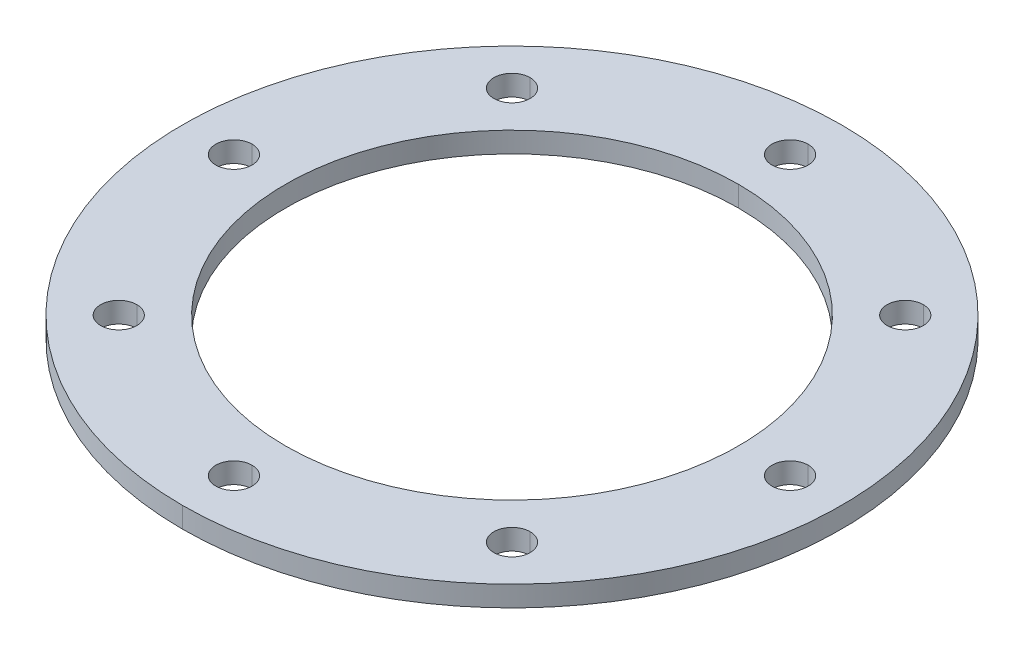
ISO-10303-21;
HEADER;
FILE_DESCRIPTION(('STEP AP214'),'2;1');
FILE_NAME('part.step','',(''),(''),'','','');
FILE_SCHEMA(('AUTOMOTIVE_DESIGN { 1 0 10303 214 1 1 1 1 }'));
ENDSEC;
DATA;
#1=APPLICATION_CONTEXT('core data for automotive mechanical design processes');
#2=APPLICATION_PROTOCOL_DEFINITION('international standard','automotive_design',2000,#1);
#3=PRODUCT_CONTEXT('',#1,'mechanical');
#4=PRODUCT('Part','Part','',(#3));
#5=PRODUCT_RELATED_PRODUCT_CATEGORY('part','',(#4));
#6=PRODUCT_DEFINITION_FORMATION('','',#4);
#7=PRODUCT_DEFINITION_CONTEXT('part definition',#1,'design');
#8=PRODUCT_DEFINITION('design','',#6,#7);
#9=PRODUCT_DEFINITION_SHAPE('','',#8);
#10=(LENGTH_UNIT() NAMED_UNIT(*) SI_UNIT(.MILLI.,.METRE.));
#11=(NAMED_UNIT(*) PLANE_ANGLE_UNIT() SI_UNIT($,.RADIAN.));
#12=(NAMED_UNIT(*) SI_UNIT($,.STERADIAN.) SOLID_ANGLE_UNIT());
#13=UNCERTAINTY_MEASURE_WITH_UNIT(LENGTH_MEASURE(1.E-05),#10,'distance_accuracy_value','');
#14=(GEOMETRIC_REPRESENTATION_CONTEXT(3) GLOBAL_UNCERTAINTY_ASSIGNED_CONTEXT((#13)) GLOBAL_UNIT_ASSIGNED_CONTEXT((#10,
#11,#12)) REPRESENTATION_CONTEXT('',''));
#15=CARTESIAN_POINT('',(0.,0.,0.));
#16=DIRECTION('',(0.,0.,1.));
#17=DIRECTION('',(1.,0.,0.));
#18=AXIS2_PLACEMENT_3D('',#15,#16,#17);
#19=CARTESIAN_POINT('',(47.729707730092,5.,-47.729707730092));
#20=DIRECTION('',(0.,-1.,0.));
#21=DIRECTION('',(0.,0.,-1.));
#22=AXIS2_PLACEMENT_3D('',#19,#20,#21);
#23=CYLINDRICAL_SURFACE('',#22,4.4);
#24=DIRECTION('',(0.,-1.,0.));
#25=VECTOR('',#24,1.);
#26=CARTESIAN_POINT('',(47.729707730092,5.,-43.3297077300919));
#27=LINE('',#26,#25);
#28=CARTESIAN_POINT('',(47.729707730092,5.,-43.3297077300919));
#29=VERTEX_POINT('',#28);
#30=CARTESIAN_POINT('',(47.729707730092,0.,-43.3297077300919));
#31=VERTEX_POINT('',#30);
#32=EDGE_CURVE('E202',#29,#31,#27,.T.);
#33=ORIENTED_EDGE('',*,*,#32,.F.);
#34=CARTESIAN_POINT('',(47.729707730092,5.,-47.729707730092));
#35=DIRECTION('',(0.,1.,0.));
#36=DIRECTION('',(0.,0.,1.));
#37=AXIS2_PLACEMENT_3D('',#34,#35,#36);
#38=CIRCLE('',#37,4.4);
#39=CARTESIAN_POINT('',(47.729707730092,5.,-52.129707730092));
#40=VERTEX_POINT('',#39);
#41=EDGE_CURVE('E199',#29,#40,#38,.T.);
#42=ORIENTED_EDGE('',*,*,#41,.T.);
#43=DIRECTION('',(0.,-1.,0.));
#44=VECTOR('',#43,1.);
#45=CARTESIAN_POINT('',(47.729707730092,5.,-52.129707730092));
#46=LINE('',#45,#44);
#47=CARTESIAN_POINT('',(47.729707730092,0.,-52.129707730092));
#48=VERTEX_POINT('',#47);
#49=EDGE_CURVE('E205',#40,#48,#46,.T.);
#50=ORIENTED_EDGE('',*,*,#49,.T.);
#51=CARTESIAN_POINT('',(47.729707730092,0.,-47.729707730092));
#52=DIRECTION('',(0.,1.,0.));
#53=DIRECTION('',(0.,0.,1.));
#54=AXIS2_PLACEMENT_3D('',#51,#52,#53);
#55=CIRCLE('',#54,4.4);
#56=EDGE_CURVE('E11',#31,#48,#55,.T.);
#57=ORIENTED_EDGE('',*,*,#56,.F.);
#58=EDGE_LOOP('',(#33,#42,#50,#57));
#59=FACE_BOUND('',#58,.T.);
#60=ADVANCED_FACE('F17',(#59),#23,.F.);
#61=CARTESIAN_POINT('',(0.,5.,-67.5));
#62=DIRECTION('',(0.,-1.,0.));
#63=DIRECTION('',(0.,0.,-1.));
#64=AXIS2_PLACEMENT_3D('',#61,#62,#63);
#65=CYLINDRICAL_SURFACE('',#64,4.4);
#66=DIRECTION('',(0.,-1.,0.));
#67=VECTOR('',#66,1.);
#68=CARTESIAN_POINT('',(0.,5.,-63.1));
#69=LINE('',#68,#67);
#70=CARTESIAN_POINT('',(0.,5.,-63.1));
#71=VERTEX_POINT('',#70);
#72=CARTESIAN_POINT('',(0.,0.,-63.1));
#73=VERTEX_POINT('',#72);
#74=EDGE_CURVE('E251',#71,#73,#69,.T.);
#75=ORIENTED_EDGE('',*,*,#74,.F.);
#76=CARTESIAN_POINT('',(0.,5.,-67.5));
#77=DIRECTION('',(0.,1.,0.));
#78=DIRECTION('',(0.,0.,1.));
#79=AXIS2_PLACEMENT_3D('',#76,#77,#78);
#80=CIRCLE('',#79,4.4);
#81=CARTESIAN_POINT('',(0.,5.,-71.9));
#82=VERTEX_POINT('',#81);
#83=EDGE_CURVE('E378',#71,#82,#80,.T.);
#84=ORIENTED_EDGE('',*,*,#83,.T.);
#85=DIRECTION('',(0.,-1.,0.));
#86=VECTOR('',#85,1.);
#87=CARTESIAN_POINT('',(0.,5.,-71.9));
#88=LINE('',#87,#86);
#89=CARTESIAN_POINT('',(0.,0.,-71.9));
#90=VERTEX_POINT('',#89);
#91=EDGE_CURVE('E270',#82,#90,#88,.T.);
#92=ORIENTED_EDGE('',*,*,#91,.T.);
#93=CARTESIAN_POINT('',(0.,0.,-67.5));
#94=DIRECTION('',(0.,1.,0.));
#95=DIRECTION('',(0.,0.,1.));
#96=AXIS2_PLACEMENT_3D('',#93,#94,#95);
#97=CIRCLE('',#96,4.4);
#98=EDGE_CURVE('E25',#73,#90,#97,.T.);
#99=ORIENTED_EDGE('',*,*,#98,.F.);
#100=EDGE_LOOP('',(#75,#84,#92,#99));
#101=FACE_BOUND('',#100,.T.);
#102=ADVANCED_FACE('F427',(#101),#65,.F.);
#103=CARTESIAN_POINT('',(-47.729707730092,5.,-47.729707730092));
#104=DIRECTION('',(0.,-1.,0.));
#105=DIRECTION('',(0.,0.,-1.));
#106=AXIS2_PLACEMENT_3D('',#103,#104,#105);
#107=CYLINDRICAL_SURFACE('',#106,4.4);
#108=DIRECTION('',(0.,-1.,0.));
#109=VECTOR('',#108,1.);
#110=CARTESIAN_POINT('',(-47.729707730092,5.,-43.3297077300919));
#111=LINE('',#110,#109);
#112=CARTESIAN_POINT('',(-47.729707730092,5.,-43.3297077300919));
#113=VERTEX_POINT('',#112);
#114=CARTESIAN_POINT('',(-47.729707730092,0.,-43.3297077300919));
#115=VERTEX_POINT('',#114);
#116=EDGE_CURVE('E238',#113,#115,#111,.T.);
#117=ORIENTED_EDGE('',*,*,#116,.F.);
#118=CARTESIAN_POINT('',(-47.729707730092,5.,-47.729707730092));
#119=DIRECTION('',(0.,1.,0.));
#120=DIRECTION('',(0.,0.,1.));
#121=AXIS2_PLACEMENT_3D('',#118,#119,#120);
#122=CIRCLE('',#121,4.4);
#123=CARTESIAN_POINT('',(-47.729707730092,5.,-52.129707730092));
#124=VERTEX_POINT('',#123);
#125=EDGE_CURVE('E209',#113,#124,#122,.T.);
#126=ORIENTED_EDGE('',*,*,#125,.T.);
#127=DIRECTION('',(0.,-1.,0.));
#128=VECTOR('',#127,1.);
#129=CARTESIAN_POINT('',(-47.729707730092,5.,-52.129707730092));
#130=LINE('',#129,#128);
#131=CARTESIAN_POINT('',(-47.729707730092,0.,-52.129707730092));
#132=VERTEX_POINT('',#131);
#133=EDGE_CURVE('E284',#124,#132,#130,.T.);
#134=ORIENTED_EDGE('',*,*,#133,.T.);
#135=CARTESIAN_POINT('',(-47.729707730092,0.,-47.729707730092));
#136=DIRECTION('',(0.,1.,0.));
#137=DIRECTION('',(0.,0.,1.));
#138=AXIS2_PLACEMENT_3D('',#135,#136,#137);
#139=CIRCLE('',#138,4.4);
#140=EDGE_CURVE('E400',#115,#132,#139,.T.);
#141=ORIENTED_EDGE('',*,*,#140,.F.);
#142=EDGE_LOOP('',(#117,#126,#134,#141));
#143=FACE_BOUND('',#142,.T.);
#144=ADVANCED_FACE('F456',(#143),#107,.F.);
#145=CARTESIAN_POINT('',(-67.5,5.,0.));
#146=DIRECTION('',(0.,-1.,0.));
#147=DIRECTION('',(0.,0.,-1.));
#148=AXIS2_PLACEMENT_3D('',#145,#146,#147);
#149=CYLINDRICAL_SURFACE('',#148,4.4);
#150=DIRECTION('',(0.,-1.,0.));
#151=VECTOR('',#150,1.);
#152=CARTESIAN_POINT('',(-67.5,5.,4.4));
#153=LINE('',#152,#151);
#154=CARTESIAN_POINT('',(-67.5,5.,4.4));
#155=VERTEX_POINT('',#154);
#156=CARTESIAN_POINT('',(-67.5,0.,4.4));
#157=VERTEX_POINT('',#156);
#158=EDGE_CURVE('E255',#155,#157,#153,.T.);
#159=ORIENTED_EDGE('',*,*,#158,.F.);
#160=CARTESIAN_POINT('',(-67.5,5.,0.));
#161=DIRECTION('',(0.,1.,0.));
#162=DIRECTION('',(0.,0.,1.));
#163=AXIS2_PLACEMENT_3D('',#160,#161,#162);
#164=CIRCLE('',#163,4.4);
#165=CARTESIAN_POINT('',(-67.5,5.,-4.4));
#166=VERTEX_POINT('',#165);
#167=EDGE_CURVE('E381',#155,#166,#164,.T.);
#168=ORIENTED_EDGE('',*,*,#167,.T.);
#169=DIRECTION('',(0.,-1.,0.));
#170=VECTOR('',#169,1.);
#171=CARTESIAN_POINT('',(-67.5,5.,-4.4));
#172=LINE('',#171,#170);
#173=CARTESIAN_POINT('',(-67.5,0.,-4.4));
#174=VERTEX_POINT('',#173);
#175=EDGE_CURVE('E288',#166,#174,#172,.T.);
#176=ORIENTED_EDGE('',*,*,#175,.T.);
#177=CARTESIAN_POINT('',(-67.5,0.,0.));
#178=DIRECTION('',(0.,1.,0.));
#179=DIRECTION('',(0.,0.,1.));
#180=AXIS2_PLACEMENT_3D('',#177,#178,#179);
#181=CIRCLE('',#180,4.4);
#182=EDGE_CURVE('E398',#157,#174,#181,.T.);
#183=ORIENTED_EDGE('',*,*,#182,.F.);
#184=EDGE_LOOP('',(#159,#168,#176,#183));
#185=FACE_BOUND('',#184,.T.);
#186=ADVANCED_FACE('F465',(#185),#149,.F.);
#187=CARTESIAN_POINT('',(-47.729707730092,5.,47.729707730092));
#188=DIRECTION('',(0.,-1.,0.));
#189=DIRECTION('',(0.,0.,-1.));
#190=AXIS2_PLACEMENT_3D('',#187,#188,#189);
#191=CYLINDRICAL_SURFACE('',#190,4.4);
#192=DIRECTION('',(0.,-1.,0.));
#193=VECTOR('',#192,1.);
#194=CARTESIAN_POINT('',(-47.729707730092,5.,52.129707730092));
#195=LINE('',#194,#193);
#196=CARTESIAN_POINT('',(-47.729707730092,5.,52.129707730092));
#197=VERTEX_POINT('',#196);
#198=CARTESIAN_POINT('',(-47.729707730092,0.,52.129707730092));
#199=VERTEX_POINT('',#198);
#200=EDGE_CURVE('E295',#197,#199,#195,.T.);
#201=ORIENTED_EDGE('',*,*,#200,.F.);
#202=CARTESIAN_POINT('',(-47.729707730092,5.,47.729707730092));
#203=DIRECTION('',(0.,1.,0.));
#204=DIRECTION('',(0.,0.,1.));
#205=AXIS2_PLACEMENT_3D('',#202,#203,#204);
#206=CIRCLE('',#205,4.4);
#207=CARTESIAN_POINT('',(-47.729707730092,5.,43.3297077300919));
#208=VERTEX_POINT('',#207);
#209=EDGE_CURVE('E359',#197,#208,#206,.T.);
#210=ORIENTED_EDGE('',*,*,#209,.T.);
#211=DIRECTION('',(0.,-1.,0.));
#212=VECTOR('',#211,1.);
#213=CARTESIAN_POINT('',(-47.729707730092,5.,43.3297077300919));
#214=LINE('',#213,#212);
#215=CARTESIAN_POINT('',(-47.729707730092,0.,43.3297077300919));
#216=VERTEX_POINT('',#215);
#217=EDGE_CURVE('E243',#208,#216,#214,.T.);
#218=ORIENTED_EDGE('',*,*,#217,.T.);
#219=CARTESIAN_POINT('',(-47.729707730092,0.,47.729707730092));
#220=DIRECTION('',(0.,1.,0.));
#221=DIRECTION('',(0.,0.,1.));
#222=AXIS2_PLACEMENT_3D('',#219,#220,#221);
#223=CIRCLE('',#222,4.4);
#224=EDGE_CURVE('E413',#199,#216,#223,.T.);
#225=ORIENTED_EDGE('',*,*,#224,.F.);
#226=EDGE_LOOP('',(#201,#210,#218,#225));
#227=FACE_BOUND('',#226,.T.);
#228=ADVANCED_FACE('F526',(#227),#191,.F.);
#229=CARTESIAN_POINT('',(0.,5.,67.5));
#230=DIRECTION('',(0.,-1.,0.));
#231=DIRECTION('',(0.,0.,-1.));
#232=AXIS2_PLACEMENT_3D('',#229,#230,#231);
#233=CYLINDRICAL_SURFACE('',#232,4.4);
#234=DIRECTION('',(0.,-1.,0.));
#235=VECTOR('',#234,1.);
#236=CARTESIAN_POINT('',(0.,5.,71.9));
#237=LINE('',#236,#235);
#238=CARTESIAN_POINT('',(0.,5.,71.9));
#239=VERTEX_POINT('',#238);
#240=CARTESIAN_POINT('',(0.,0.,71.9));
#241=VERTEX_POINT('',#240);
#242=EDGE_CURVE('E306',#239,#241,#237,.T.);
#243=ORIENTED_EDGE('',*,*,#242,.F.);
#244=CARTESIAN_POINT('',(0.,5.,67.5));
#245=DIRECTION('',(0.,1.,0.));
#246=DIRECTION('',(0.,0.,1.));
#247=AXIS2_PLACEMENT_3D('',#244,#245,#246);
#248=CIRCLE('',#247,4.4);
#249=CARTESIAN_POINT('',(0.,5.,63.1));
#250=VERTEX_POINT('',#249);
#251=EDGE_CURVE('E383',#239,#250,#248,.T.);
#252=ORIENTED_EDGE('',*,*,#251,.T.);
#253=DIRECTION('',(0.,-1.,0.));
#254=VECTOR('',#253,1.);
#255=CARTESIAN_POINT('',(0.,5.,63.1));
#256=LINE('',#255,#254);
#257=CARTESIAN_POINT('',(0.,0.,63.1));
#258=VERTEX_POINT('',#257);
#259=EDGE_CURVE('E321',#250,#258,#256,.T.);
#260=ORIENTED_EDGE('',*,*,#259,.T.);
#261=CARTESIAN_POINT('',(0.,0.,67.5));
#262=DIRECTION('',(0.,1.,0.));
#263=DIRECTION('',(0.,0.,1.));
#264=AXIS2_PLACEMENT_3D('',#261,#262,#263);
#265=CIRCLE('',#264,4.4);
#266=EDGE_CURVE('E415',#241,#258,#265,.T.);
#267=ORIENTED_EDGE('',*,*,#266,.F.);
#268=EDGE_LOOP('',(#243,#252,#260,#267));
#269=FACE_BOUND('',#268,.T.);
#270=ADVANCED_FACE('F472',(#269),#233,.F.);
#271=CARTESIAN_POINT('',(47.729707730092,5.,47.729707730092));
#272=DIRECTION('',(0.,-1.,0.));
#273=DIRECTION('',(0.,0.,-1.));
#274=AXIS2_PLACEMENT_3D('',#271,#272,#273);
#275=CYLINDRICAL_SURFACE('',#274,4.4);
#276=DIRECTION('',(0.,-1.,0.));
#277=VECTOR('',#276,1.);
#278=CARTESIAN_POINT('',(47.729707730092,5.,52.129707730092));
#279=LINE('',#278,#277);
#280=CARTESIAN_POINT('',(47.729707730092,5.,52.129707730092));
#281=VERTEX_POINT('',#280);
#282=CARTESIAN_POINT('',(47.729707730092,0.,52.129707730092));
#283=VERTEX_POINT('',#282);
#284=EDGE_CURVE('E328',#281,#283,#279,.T.);
#285=ORIENTED_EDGE('',*,*,#284,.F.);
#286=CARTESIAN_POINT('',(47.729707730092,5.,47.729707730092));
#287=DIRECTION('',(0.,1.,0.));
#288=DIRECTION('',(0.,0.,1.));
#289=AXIS2_PLACEMENT_3D('',#286,#287,#288);
#290=CIRCLE('',#289,4.4);
#291=CARTESIAN_POINT('',(47.729707730092,5.,43.3297077300919));
#292=VERTEX_POINT('',#291);
#293=EDGE_CURVE('E363',#281,#292,#290,.T.);
#294=ORIENTED_EDGE('',*,*,#293,.T.);
#295=DIRECTION('',(0.,-1.,0.));
#296=VECTOR('',#295,1.);
#297=CARTESIAN_POINT('',(47.729707730092,5.,43.3297077300919));
#298=LINE('',#297,#296);
#299=CARTESIAN_POINT('',(47.729707730092,0.,43.3297077300919));
#300=VERTEX_POINT('',#299);
#301=EDGE_CURVE('E337',#292,#300,#298,.T.);
#302=ORIENTED_EDGE('',*,*,#301,.T.);
#303=CARTESIAN_POINT('',(47.729707730092,0.,47.729707730092));
#304=DIRECTION('',(0.,1.,0.));
#305=DIRECTION('',(0.,0.,1.));
#306=AXIS2_PLACEMENT_3D('',#303,#304,#305);
#307=CIRCLE('',#306,4.4);
#308=EDGE_CURVE('E408',#283,#300,#307,.T.);
#309=ORIENTED_EDGE('',*,*,#308,.F.);
#310=EDGE_LOOP('',(#285,#294,#302,#309));
#311=FACE_BOUND('',#310,.T.);
#312=ADVANCED_FACE('F469',(#311),#275,.F.);
#313=CARTESIAN_POINT('',(67.5,5.,0.));
#314=DIRECTION('',(0.,-1.,0.));
#315=DIRECTION('',(0.,0.,-1.));
#316=AXIS2_PLACEMENT_3D('',#313,#314,#315);
#317=CYLINDRICAL_SURFACE('',#316,4.4);
#318=DIRECTION('',(0.,-1.,0.));
#319=VECTOR('',#318,1.);
#320=CARTESIAN_POINT('',(67.5,5.,4.4));
#321=LINE('',#320,#319);
#322=CARTESIAN_POINT('',(67.5,5.,4.4));
#323=VERTEX_POINT('',#322);
#324=CARTESIAN_POINT('',(67.5,0.,4.4));
#325=VERTEX_POINT('',#324);
#326=EDGE_CURVE('E234',#323,#325,#321,.T.);
#327=ORIENTED_EDGE('',*,*,#326,.F.);
#328=CARTESIAN_POINT('',(67.5,5.,0.));
#329=DIRECTION('',(0.,1.,0.));
#330=DIRECTION('',(0.,0.,1.));
#331=AXIS2_PLACEMENT_3D('',#328,#329,#330);
#332=CIRCLE('',#331,4.4);
#333=CARTESIAN_POINT('',(67.5,5.,-4.4));
#334=VERTEX_POINT('',#333);
#335=EDGE_CURVE('E390',#323,#334,#332,.T.);
#336=ORIENTED_EDGE('',*,*,#335,.T.);
#337=DIRECTION('',(0.,-1.,0.));
#338=VECTOR('',#337,1.);
#339=CARTESIAN_POINT('',(67.5,5.,-4.4));
#340=LINE('',#339,#338);
#341=CARTESIAN_POINT('',(67.5,0.,-4.4));
#342=VERTEX_POINT('',#341);
#343=EDGE_CURVE('E346',#334,#342,#340,.T.);
#344=ORIENTED_EDGE('',*,*,#343,.T.);
#345=CARTESIAN_POINT('',(67.5,0.,0.));
#346=DIRECTION('',(0.,1.,0.));
#347=DIRECTION('',(0.,0.,1.));
#348=AXIS2_PLACEMENT_3D('',#345,#346,#347);
#349=CIRCLE('',#348,4.4);
#350=EDGE_CURVE('E406',#325,#342,#349,.T.);
#351=ORIENTED_EDGE('',*,*,#350,.F.);
#352=EDGE_LOOP('',(#327,#336,#344,#351));
#353=FACE_BOUND('',#352,.T.);
#354=ADVANCED_FACE('F473',(#353),#317,.F.);
#355=CARTESIAN_POINT('',(0.,5.,0.));
#356=DIRECTION('',(0.,-1.,0.));
#357=DIRECTION('',(0.,0.,-1.));
#358=AXIS2_PLACEMENT_3D('',#355,#356,#357);
#359=CYLINDRICAL_SURFACE('',#358,55.);
#360=DIRECTION('',(0.,-1.,0.));
#361=VECTOR('',#360,1.);
#362=CARTESIAN_POINT('',(0.,5.,55.));
#363=LINE('',#362,#361);
#364=CARTESIAN_POINT('',(0.,5.,55.));
#365=VERTEX_POINT('',#364);
#366=CARTESIAN_POINT('',(0.,0.,55.));
#367=VERTEX_POINT('',#366);
#368=EDGE_CURVE('E272',#365,#367,#363,.T.);
#369=ORIENTED_EDGE('',*,*,#368,.F.);
#370=CARTESIAN_POINT('',(0.,5.,0.));
#371=DIRECTION('',(0.,1.,0.));
#372=DIRECTION('',(0.,0.,1.));
#373=AXIS2_PLACEMENT_3D('',#370,#371,#372);
#374=CIRCLE('',#373,55.);
#375=CARTESIAN_POINT('',(0.,5.,-55.));
#376=VERTEX_POINT('',#375);
#377=EDGE_CURVE('E388',#365,#376,#374,.T.);
#378=ORIENTED_EDGE('',*,*,#377,.T.);
#379=DIRECTION('',(0.,-1.,0.));
#380=VECTOR('',#379,1.);
#381=CARTESIAN_POINT('',(0.,5.,-55.));
#382=LINE('',#381,#380);
#383=CARTESIAN_POINT('',(0.,0.,-55.));
#384=VERTEX_POINT('',#383);
#385=EDGE_CURVE('E275',#376,#384,#382,.T.);
#386=ORIENTED_EDGE('',*,*,#385,.T.);
#387=CARTESIAN_POINT('',(0.,0.,0.));
#388=DIRECTION('',(0.,1.,0.));
#389=DIRECTION('',(0.,0.,1.));
#390=AXIS2_PLACEMENT_3D('',#387,#388,#389);
#391=CIRCLE('',#390,55.);
#392=EDGE_CURVE('E403',#367,#384,#391,.T.);
#393=ORIENTED_EDGE('',*,*,#392,.F.);
#394=EDGE_LOOP('',(#369,#378,#386,#393));
#395=FACE_BOUND('',#394,.T.);
#396=ADVANCED_FACE('F448',(#395),#359,.F.);
#397=CARTESIAN_POINT('',(0.,5.,0.));
#398=DIRECTION('',(0.,-1.,0.));
#399=DIRECTION('',(0.,0.,-1.));
#400=AXIS2_PLACEMENT_3D('',#397,#398,#399);
#401=CYLINDRICAL_SURFACE('',#400,80.);
#402=DIRECTION('',(0.,-1.,0.));
#403=VECTOR('',#402,1.);
#404=CARTESIAN_POINT('',(0.,5.,80.));
#405=LINE('',#404,#403);
#406=CARTESIAN_POINT('',(0.,5.,80.));
#407=VERTEX_POINT('',#406);
#408=CARTESIAN_POINT('',(0.,0.,80.));
#409=VERTEX_POINT('',#408);
#410=EDGE_CURVE('E311',#407,#409,#405,.T.);
#411=ORIENTED_EDGE('',*,*,#410,.F.);
#412=CARTESIAN_POINT('',(0.,5.,0.));
#413=DIRECTION('',(0.,1.,0.));
#414=DIRECTION('',(0.,0.,1.));
#415=AXIS2_PLACEMENT_3D('',#412,#413,#414);
#416=CIRCLE('',#415,80.);
#417=CARTESIAN_POINT('',(0.,5.,-80.));
#418=VERTEX_POINT('',#417);
#419=EDGE_CURVE('E374',#418,#407,#416,.T.);
#420=ORIENTED_EDGE('',*,*,#419,.F.);
#421=DIRECTION('',(0.,-1.,0.));
#422=VECTOR('',#421,1.);
#423=CARTESIAN_POINT('',(0.,5.,-80.));
#424=LINE('',#423,#422);
#425=CARTESIAN_POINT('',(0.,0.,-80.));
#426=VERTEX_POINT('',#425);
#427=EDGE_CURVE('E375',#418,#426,#424,.T.);
#428=ORIENTED_EDGE('',*,*,#427,.T.);
#429=CARTESIAN_POINT('',(0.,0.,0.));
#430=DIRECTION('',(0.,1.,0.));
#431=DIRECTION('',(0.,0.,1.));
#432=AXIS2_PLACEMENT_3D('',#429,#430,#431);
#433=CIRCLE('',#432,80.);
#434=EDGE_CURVE('E40',#426,#409,#433,.T.);
#435=ORIENTED_EDGE('',*,*,#434,.T.);
#436=EDGE_LOOP('',(#411,#420,#428,#435));
#437=FACE_BOUND('',#436,.T.);
#438=ADVANCED_FACE('F439',(#437),#401,.T.);
#439=CARTESIAN_POINT('',(0.,0.,0.));
#440=DIRECTION('',(0.,1.,0.));
#441=DIRECTION('',(1.,0.,0.));
#442=AXIS2_PLACEMENT_3D('',#439,#440,#441);
#443=PLANE('',#442);
#444=CARTESIAN_POINT('',(47.729707730092,0.,-47.729707730092));
#445=DIRECTION('',(0.,1.,0.));
#446=DIRECTION('',(0.,0.,1.));
#447=AXIS2_PLACEMENT_3D('',#444,#445,#446);
#448=CIRCLE('',#447,4.4);
#449=EDGE_CURVE('E216',#48,#31,#448,.T.);
#450=ORIENTED_EDGE('',*,*,#449,.T.);
#451=ORIENTED_EDGE('',*,*,#56,.T.);
#452=EDGE_LOOP('',(#450,#451));
#453=FACE_BOUND('',#452,.T.);
#454=CARTESIAN_POINT('',(0.,0.,-67.5));
#455=DIRECTION('',(0.,1.,0.));
#456=DIRECTION('',(0.,0.,1.));
#457=AXIS2_PLACEMENT_3D('',#454,#455,#456);
#458=CIRCLE('',#457,4.4);
#459=EDGE_CURVE('E263',#90,#73,#458,.T.);
#460=ORIENTED_EDGE('',*,*,#459,.T.);
#461=ORIENTED_EDGE('',*,*,#98,.T.);
#462=EDGE_LOOP('',(#460,#461));
#463=FACE_BOUND('',#462,.T.);
#464=CARTESIAN_POINT('',(-47.729707730092,0.,-47.729707730092));
#465=DIRECTION('',(0.,1.,0.));
#466=DIRECTION('',(0.,0.,1.));
#467=AXIS2_PLACEMENT_3D('',#464,#465,#466);
#468=CIRCLE('',#467,4.4);
#469=EDGE_CURVE('E245',#132,#115,#468,.T.);
#470=ORIENTED_EDGE('',*,*,#469,.T.);
#471=ORIENTED_EDGE('',*,*,#140,.T.);
#472=EDGE_LOOP('',(#470,#471));
#473=FACE_BOUND('',#472,.T.);
#474=CARTESIAN_POINT('',(-67.5,0.,0.));
#475=DIRECTION('',(0.,1.,0.));
#476=DIRECTION('',(0.,0.,1.));
#477=AXIS2_PLACEMENT_3D('',#474,#475,#476);
#478=CIRCLE('',#477,4.4);
#479=EDGE_CURVE('E256',#174,#157,#478,.T.);
#480=ORIENTED_EDGE('',*,*,#479,.T.);
#481=ORIENTED_EDGE('',*,*,#182,.T.);
#482=EDGE_LOOP('',(#480,#481));
#483=FACE_BOUND('',#482,.T.);
#484=CARTESIAN_POINT('',(-47.729707730092,0.,47.729707730092));
#485=DIRECTION('',(0.,1.,0.));
#486=DIRECTION('',(0.,0.,1.));
#487=AXIS2_PLACEMENT_3D('',#484,#485,#486);
#488=CIRCLE('',#487,4.4);
#489=EDGE_CURVE('E246',#216,#199,#488,.T.);
#490=ORIENTED_EDGE('',*,*,#489,.T.);
#491=ORIENTED_EDGE('',*,*,#224,.T.);
#492=EDGE_LOOP('',(#490,#491));
#493=FACE_BOUND('',#492,.T.);
#494=CARTESIAN_POINT('',(0.,0.,67.5));
#495=DIRECTION('',(0.,1.,0.));
#496=DIRECTION('',(0.,0.,1.));
#497=AXIS2_PLACEMENT_3D('',#494,#495,#496);
#498=CIRCLE('',#497,4.4);
#499=EDGE_CURVE('E320',#258,#241,#498,.T.);
#500=ORIENTED_EDGE('',*,*,#499,.T.);
#501=ORIENTED_EDGE('',*,*,#266,.T.);
#502=EDGE_LOOP('',(#500,#501));
#503=FACE_BOUND('',#502,.T.);
#504=CARTESIAN_POINT('',(47.729707730092,0.,47.729707730092));
#505=DIRECTION('',(0.,1.,0.));
#506=DIRECTION('',(0.,0.,1.));
#507=AXIS2_PLACEMENT_3D('',#504,#505,#506);
#508=CIRCLE('',#507,4.4);
#509=EDGE_CURVE('E334',#300,#283,#508,.T.);
#510=ORIENTED_EDGE('',*,*,#509,.T.);
#511=ORIENTED_EDGE('',*,*,#308,.T.);
#512=EDGE_LOOP('',(#510,#511));
#513=FACE_BOUND('',#512,.T.);
#514=CARTESIAN_POINT('',(67.5,0.,0.));
#515=DIRECTION('',(0.,1.,0.));
#516=DIRECTION('',(0.,0.,1.));
#517=AXIS2_PLACEMENT_3D('',#514,#515,#516);
#518=CIRCLE('',#517,4.4);
#519=EDGE_CURVE('E233',#342,#325,#518,.T.);
#520=ORIENTED_EDGE('',*,*,#519,.T.);
#521=ORIENTED_EDGE('',*,*,#350,.T.);
#522=EDGE_LOOP('',(#520,#521));
#523=FACE_BOUND('',#522,.T.);
#524=CARTESIAN_POINT('',(0.,0.,0.));
#525=DIRECTION('',(0.,1.,0.));
#526=DIRECTION('',(0.,0.,1.));
#527=AXIS2_PLACEMENT_3D('',#524,#525,#526);
#528=CIRCLE('',#527,55.);
#529=EDGE_CURVE('E268',#384,#367,#528,.T.);
#530=ORIENTED_EDGE('',*,*,#529,.T.);
#531=ORIENTED_EDGE('',*,*,#392,.T.);
#532=EDGE_LOOP('',(#530,#531));
#533=FACE_BOUND('',#532,.T.);
#534=ORIENTED_EDGE('',*,*,#434,.F.);
#535=CARTESIAN_POINT('',(0.,0.,0.));
#536=DIRECTION('',(0.,1.,0.));
#537=DIRECTION('',(0.,0.,1.));
#538=AXIS2_PLACEMENT_3D('',#535,#536,#537);
#539=CIRCLE('',#538,80.);
#540=EDGE_CURVE('E366',#409,#426,#539,.T.);
#541=ORIENTED_EDGE('',*,*,#540,.F.);
#542=EDGE_LOOP('',(#534,#541));
#543=FACE_BOUND('',#542,.T.);
#544=ADVANCED_FACE('F421',(#453,#463,#473,#483,#493,#503,#513,#523,#533,#543),#443,.F.);
#545=CARTESIAN_POINT('',(0.,5.,0.));
#546=DIRECTION('',(0.,1.,0.));
#547=DIRECTION('',(1.,0.,0.));
#548=AXIS2_PLACEMENT_3D('',#545,#546,#547);
#549=PLANE('',#548);
#550=CARTESIAN_POINT('',(47.729707730092,5.,-47.729707730092));
#551=DIRECTION('',(0.,1.,0.));
#552=DIRECTION('',(0.,0.,1.));
#553=AXIS2_PLACEMENT_3D('',#550,#551,#552);
#554=CIRCLE('',#553,4.4);
#555=EDGE_CURVE('E212',#40,#29,#554,.T.);
#556=ORIENTED_EDGE('',*,*,#555,.F.);
#557=ORIENTED_EDGE('',*,*,#41,.F.);
#558=EDGE_LOOP('',(#556,#557));
#559=FACE_BOUND('',#558,.T.);
#560=CARTESIAN_POINT('',(-47.729707730092,5.,-47.729707730092));
#561=DIRECTION('',(0.,1.,0.));
#562=DIRECTION('',(0.,0.,1.));
#563=AXIS2_PLACEMENT_3D('',#560,#561,#562);
#564=CIRCLE('',#563,4.4);
#565=EDGE_CURVE('E242',#124,#113,#564,.T.);
#566=ORIENTED_EDGE('',*,*,#565,.F.);
#567=ORIENTED_EDGE('',*,*,#125,.F.);
#568=EDGE_LOOP('',(#566,#567));
#569=FACE_BOUND('',#568,.T.);
#570=CARTESIAN_POINT('',(-47.729707730092,5.,47.729707730092));
#571=DIRECTION('',(0.,1.,0.));
#572=DIRECTION('',(0.,0.,1.));
#573=AXIS2_PLACEMENT_3D('',#570,#571,#572);
#574=CIRCLE('',#573,4.4);
#575=EDGE_CURVE('E294',#208,#197,#574,.T.);
#576=ORIENTED_EDGE('',*,*,#575,.F.);
#577=ORIENTED_EDGE('',*,*,#209,.F.);
#578=EDGE_LOOP('',(#576,#577));
#579=FACE_BOUND('',#578,.T.);
#580=CARTESIAN_POINT('',(47.729707730092,5.,47.729707730092));
#581=DIRECTION('',(0.,1.,0.));
#582=DIRECTION('',(0.,0.,1.));
#583=AXIS2_PLACEMENT_3D('',#580,#581,#582);
#584=CIRCLE('',#583,4.4);
#585=EDGE_CURVE('E324',#292,#281,#584,.T.);
#586=ORIENTED_EDGE('',*,*,#585,.F.);
#587=ORIENTED_EDGE('',*,*,#293,.F.);
#588=EDGE_LOOP('',(#586,#587));
#589=FACE_BOUND('',#588,.T.);
#590=CARTESIAN_POINT('',(0.,5.,0.));
#591=DIRECTION('',(0.,1.,0.));
#592=DIRECTION('',(0.,0.,1.));
#593=AXIS2_PLACEMENT_3D('',#590,#591,#592);
#594=CIRCLE('',#593,55.);
#595=EDGE_CURVE('E351',#376,#365,#594,.T.);
#596=ORIENTED_EDGE('',*,*,#595,.F.);
#597=ORIENTED_EDGE('',*,*,#377,.F.);
#598=EDGE_LOOP('',(#596,#597));
#599=FACE_BOUND('',#598,.T.);
#600=CARTESIAN_POINT('',(67.5,5.,0.));
#601=DIRECTION('',(0.,1.,0.));
#602=DIRECTION('',(0.,0.,1.));
#603=AXIS2_PLACEMENT_3D('',#600,#601,#602);
#604=CIRCLE('',#603,4.4);
#605=EDGE_CURVE('E240',#334,#323,#604,.T.);
#606=ORIENTED_EDGE('',*,*,#605,.F.);
#607=ORIENTED_EDGE('',*,*,#335,.F.);
#608=EDGE_LOOP('',(#606,#607));
#609=FACE_BOUND('',#608,.T.);
#610=CARTESIAN_POINT('',(0.,5.,67.5));
#611=DIRECTION('',(0.,1.,0.));
#612=DIRECTION('',(0.,0.,1.));
#613=AXIS2_PLACEMENT_3D('',#610,#611,#612);
#614=CIRCLE('',#613,4.4);
#615=EDGE_CURVE('E249',#250,#239,#614,.T.);
#616=ORIENTED_EDGE('',*,*,#615,.F.);
#617=ORIENTED_EDGE('',*,*,#251,.F.);
#618=EDGE_LOOP('',(#616,#617));
#619=FACE_BOUND('',#618,.T.);
#620=CARTESIAN_POINT('',(-67.5,5.,0.));
#621=DIRECTION('',(0.,1.,0.));
#622=DIRECTION('',(0.,0.,1.));
#623=AXIS2_PLACEMENT_3D('',#620,#621,#622);
#624=CIRCLE('',#623,4.4);
#625=EDGE_CURVE('E259',#166,#155,#624,.T.);
#626=ORIENTED_EDGE('',*,*,#625,.F.);
#627=ORIENTED_EDGE('',*,*,#167,.F.);
#628=EDGE_LOOP('',(#626,#627));
#629=FACE_BOUND('',#628,.T.);
#630=CARTESIAN_POINT('',(0.,5.,-67.5));
#631=DIRECTION('',(0.,1.,0.));
#632=DIRECTION('',(0.,0.,1.));
#633=AXIS2_PLACEMENT_3D('',#630,#631,#632);
#634=CIRCLE('',#633,4.4);
#635=EDGE_CURVE('E217',#82,#71,#634,.T.);
#636=ORIENTED_EDGE('',*,*,#635,.F.);
#637=ORIENTED_EDGE('',*,*,#83,.F.);
#638=EDGE_LOOP('',(#636,#637));
#639=FACE_BOUND('',#638,.T.);
#640=ORIENTED_EDGE('',*,*,#419,.T.);
#641=CARTESIAN_POINT('',(0.,5.,0.));
#642=DIRECTION('',(0.,1.,0.));
#643=DIRECTION('',(0.,0.,1.));
#644=AXIS2_PLACEMENT_3D('',#641,#642,#643);
#645=CIRCLE('',#644,80.);
#646=EDGE_CURVE('E310',#407,#418,#645,.T.);
#647=ORIENTED_EDGE('',*,*,#646,.T.);
#648=EDGE_LOOP('',(#640,#647));
#649=FACE_BOUND('',#648,.T.);
#650=ADVANCED_FACE('F219',(#559,#569,#579,#589,#599,#609,#619,#629,#639,#649),#549,.T.);
#651=CARTESIAN_POINT('',(0.,5.,0.));
#652=DIRECTION('',(0.,-1.,0.));
#653=DIRECTION('',(0.,0.,-1.));
#654=AXIS2_PLACEMENT_3D('',#651,#652,#653);
#655=CYLINDRICAL_SURFACE('',#654,80.);
#656=ORIENTED_EDGE('',*,*,#646,.F.);
#657=ORIENTED_EDGE('',*,*,#410,.T.);
#658=ORIENTED_EDGE('',*,*,#540,.T.);
#659=ORIENTED_EDGE('',*,*,#427,.F.);
#660=EDGE_LOOP('',(#656,#657,#658,#659));
#661=FACE_BOUND('',#660,.T.);
#662=ADVANCED_FACE('F436',(#661),#655,.T.);
#663=CARTESIAN_POINT('',(0.,5.,0.));
#664=DIRECTION('',(0.,-1.,0.));
#665=DIRECTION('',(0.,0.,-1.));
#666=AXIS2_PLACEMENT_3D('',#663,#664,#665);
#667=CYLINDRICAL_SURFACE('',#666,55.);
#668=ORIENTED_EDGE('',*,*,#595,.T.);
#669=ORIENTED_EDGE('',*,*,#368,.T.);
#670=ORIENTED_EDGE('',*,*,#529,.F.);
#671=ORIENTED_EDGE('',*,*,#385,.F.);
#672=EDGE_LOOP('',(#668,#669,#670,#671));
#673=FACE_BOUND('',#672,.T.);
#674=ADVANCED_FACE('F488',(#673),#667,.F.);
#675=CARTESIAN_POINT('',(67.5,5.,0.));
#676=DIRECTION('',(0.,-1.,0.));
#677=DIRECTION('',(0.,0.,-1.));
#678=AXIS2_PLACEMENT_3D('',#675,#676,#677);
#679=CYLINDRICAL_SURFACE('',#678,4.4);
#680=ORIENTED_EDGE('',*,*,#605,.T.);
#681=ORIENTED_EDGE('',*,*,#326,.T.);
#682=ORIENTED_EDGE('',*,*,#519,.F.);
#683=ORIENTED_EDGE('',*,*,#343,.F.);
#684=EDGE_LOOP('',(#680,#681,#682,#683));
#685=FACE_BOUND('',#684,.T.);
#686=ADVANCED_FACE('F484',(#685),#679,.F.);
#687=CARTESIAN_POINT('',(47.729707730092,5.,47.729707730092));
#688=DIRECTION('',(0.,-1.,0.));
#689=DIRECTION('',(0.,0.,-1.));
#690=AXIS2_PLACEMENT_3D('',#687,#688,#689);
#691=CYLINDRICAL_SURFACE('',#690,4.4);
#692=ORIENTED_EDGE('',*,*,#585,.T.);
#693=ORIENTED_EDGE('',*,*,#284,.T.);
#694=ORIENTED_EDGE('',*,*,#509,.F.);
#695=ORIENTED_EDGE('',*,*,#301,.F.);
#696=EDGE_LOOP('',(#692,#693,#694,#695));
#697=FACE_BOUND('',#696,.T.);
#698=ADVANCED_FACE('F476',(#697),#691,.F.);
#699=CARTESIAN_POINT('',(0.,5.,67.5));
#700=DIRECTION('',(0.,-1.,0.));
#701=DIRECTION('',(0.,0.,-1.));
#702=AXIS2_PLACEMENT_3D('',#699,#700,#701);
#703=CYLINDRICAL_SURFACE('',#702,4.4);
#704=ORIENTED_EDGE('',*,*,#615,.T.);
#705=ORIENTED_EDGE('',*,*,#242,.T.);
#706=ORIENTED_EDGE('',*,*,#499,.F.);
#707=ORIENTED_EDGE('',*,*,#259,.F.);
#708=EDGE_LOOP('',(#704,#705,#706,#707));
#709=FACE_BOUND('',#708,.T.);
#710=ADVANCED_FACE('F475',(#709),#703,.F.);
#711=CARTESIAN_POINT('',(-47.729707730092,5.,47.729707730092));
#712=DIRECTION('',(0.,-1.,0.));
#713=DIRECTION('',(0.,0.,-1.));
#714=AXIS2_PLACEMENT_3D('',#711,#712,#713);
#715=CYLINDRICAL_SURFACE('',#714,4.4);
#716=ORIENTED_EDGE('',*,*,#575,.T.);
#717=ORIENTED_EDGE('',*,*,#200,.T.);
#718=ORIENTED_EDGE('',*,*,#489,.F.);
#719=ORIENTED_EDGE('',*,*,#217,.F.);
#720=EDGE_LOOP('',(#716,#717,#718,#719));
#721=FACE_BOUND('',#720,.T.);
#722=ADVANCED_FACE('F480',(#721),#715,.F.);
#723=CARTESIAN_POINT('',(-67.5,5.,0.));
#724=DIRECTION('',(0.,-1.,0.));
#725=DIRECTION('',(0.,0.,-1.));
#726=AXIS2_PLACEMENT_3D('',#723,#724,#725);
#727=CYLINDRICAL_SURFACE('',#726,4.4);
#728=ORIENTED_EDGE('',*,*,#625,.T.);
#729=ORIENTED_EDGE('',*,*,#158,.T.);
#730=ORIENTED_EDGE('',*,*,#479,.F.);
#731=ORIENTED_EDGE('',*,*,#175,.F.);
#732=EDGE_LOOP('',(#728,#729,#730,#731));
#733=FACE_BOUND('',#732,.T.);
#734=ADVANCED_FACE('F477',(#733),#727,.F.);
#735=CARTESIAN_POINT('',(-47.729707730092,5.,-47.729707730092));
#736=DIRECTION('',(0.,-1.,0.));
#737=DIRECTION('',(0.,0.,-1.));
#738=AXIS2_PLACEMENT_3D('',#735,#736,#737);
#739=CYLINDRICAL_SURFACE('',#738,4.4);
#740=ORIENTED_EDGE('',*,*,#565,.T.);
#741=ORIENTED_EDGE('',*,*,#116,.T.);
#742=ORIENTED_EDGE('',*,*,#469,.F.);
#743=ORIENTED_EDGE('',*,*,#133,.F.);
#744=EDGE_LOOP('',(#740,#741,#742,#743));
#745=FACE_BOUND('',#744,.T.);
#746=ADVANCED_FACE('F467',(#745),#739,.F.);
#747=CARTESIAN_POINT('',(0.,5.,-67.5));
#748=DIRECTION('',(0.,-1.,0.));
#749=DIRECTION('',(0.,0.,-1.));
#750=AXIS2_PLACEMENT_3D('',#747,#748,#749);
#751=CYLINDRICAL_SURFACE('',#750,4.4);
#752=ORIENTED_EDGE('',*,*,#635,.T.);
#753=ORIENTED_EDGE('',*,*,#74,.T.);
#754=ORIENTED_EDGE('',*,*,#459,.F.);
#755=ORIENTED_EDGE('',*,*,#91,.F.);
#756=EDGE_LOOP('',(#752,#753,#754,#755));
#757=FACE_BOUND('',#756,.T.);
#758=ADVANCED_FACE('F435',(#757),#751,.F.);
#759=CARTESIAN_POINT('',(47.729707730092,5.,-47.729707730092));
#760=DIRECTION('',(0.,-1.,0.));
#761=DIRECTION('',(0.,0.,-1.));
#762=AXIS2_PLACEMENT_3D('',#759,#760,#761);
#763=CYLINDRICAL_SURFACE('',#762,4.4);
#764=ORIENTED_EDGE('',*,*,#555,.T.);
#765=ORIENTED_EDGE('',*,*,#32,.T.);
#766=ORIENTED_EDGE('',*,*,#449,.F.);
#767=ORIENTED_EDGE('',*,*,#49,.F.);
#768=EDGE_LOOP('',(#764,#765,#766,#767));
#769=FACE_BOUND('',#768,.T.);
#770=ADVANCED_FACE('F213',(#769),#763,.F.);
#771=CLOSED_SHELL('',(#60,#102,#144,#186,#228,#270,#312,#354,#396,#438,#544,#650,#662,#674,#686,
#698,#710,#722,#734,#746,#758,#770));
#772=MANIFOLD_SOLID_BREP('B1',#771);
#773=ADVANCED_BREP_SHAPE_REPRESENTATION('',(#18,#772),#14);
#774=SHAPE_DEFINITION_REPRESENTATION(#9,#773);
ENDSEC;
END-ISO-10303-21;
